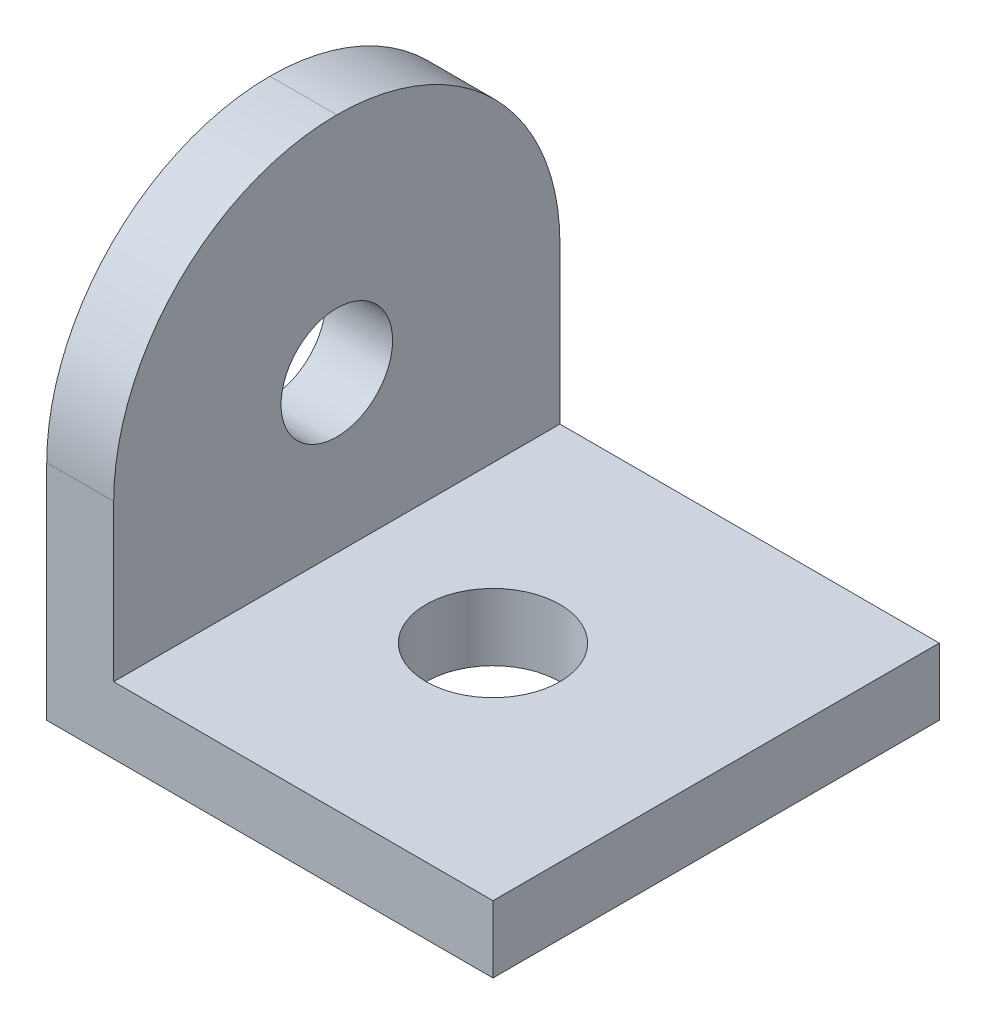
ISO-10303-21;
HEADER;
FILE_DESCRIPTION(('STEP AP214'),'2;1');
FILE_NAME('part.step','',(''),(''),'','','');
FILE_SCHEMA(('AUTOMOTIVE_DESIGN { 1 0 10303 214 1 1 1 1 }'));
ENDSEC;
DATA;
#1=APPLICATION_CONTEXT('core data for automotive mechanical design processes');
#2=APPLICATION_PROTOCOL_DEFINITION('international standard','automotive_design',2000,#1);
#3=PRODUCT_CONTEXT('',#1,'mechanical');
#4=PRODUCT('Part','Part','',(#3));
#5=PRODUCT_RELATED_PRODUCT_CATEGORY('part','',(#4));
#6=PRODUCT_DEFINITION_FORMATION('','',#4);
#7=PRODUCT_DEFINITION_CONTEXT('part definition',#1,'design');
#8=PRODUCT_DEFINITION('design','',#6,#7);
#9=PRODUCT_DEFINITION_SHAPE('','',#8);
#10=(LENGTH_UNIT() NAMED_UNIT(*) SI_UNIT(.MILLI.,.METRE.));
#11=(NAMED_UNIT(*) PLANE_ANGLE_UNIT() SI_UNIT($,.RADIAN.));
#12=(NAMED_UNIT(*) SI_UNIT($,.STERADIAN.) SOLID_ANGLE_UNIT());
#13=UNCERTAINTY_MEASURE_WITH_UNIT(LENGTH_MEASURE(1.E-05),#10,'distance_accuracy_value','');
#14=(GEOMETRIC_REPRESENTATION_CONTEXT(3) GLOBAL_UNCERTAINTY_ASSIGNED_CONTEXT((#13)) GLOBAL_UNIT_ASSIGNED_CONTEXT((#10,
#11,#12)) REPRESENTATION_CONTEXT('',''));
#15=CARTESIAN_POINT('',(0.,0.,0.));
#16=DIRECTION('',(0.,0.,1.));
#17=DIRECTION('',(1.,0.,0.));
#18=AXIS2_PLACEMENT_3D('',#15,#16,#17);
#19=CARTESIAN_POINT('',(10.,20.,-10.));
#20=DIRECTION('',(-1.,0.,0.));
#21=DIRECTION('',(0.,0.,1.));
#22=AXIS2_PLACEMENT_3D('',#19,#20,#21);
#23=PLANE('',#22);
#24=DIRECTION('',(0.,-1.,0.));
#25=VECTOR('',#24,1.);
#26=CARTESIAN_POINT('',(10.,20.,-10.));
#27=LINE('',#26,#25);
#28=CARTESIAN_POINT('',(10.,3.,-10.));
#29=VERTEX_POINT('',#28);
#30=CARTESIAN_POINT('',(10.,0.,-10.));
#31=VERTEX_POINT('',#30);
#32=EDGE_CURVE('E141',#29,#31,#27,.T.);
#33=ORIENTED_EDGE('',*,*,#32,.F.);
#34=DIRECTION('',(0.,0.,1.));
#35=VECTOR('',#34,1.);
#36=CARTESIAN_POINT('',(10.,3.,-10.));
#37=LINE('',#36,#35);
#38=CARTESIAN_POINT('',(10.,3.,10.));
#39=VERTEX_POINT('',#38);
#40=EDGE_CURVE('E113',#29,#39,#37,.T.);
#41=ORIENTED_EDGE('',*,*,#40,.T.);
#42=DIRECTION('',(0.,-1.,0.));
#43=VECTOR('',#42,1.);
#44=CARTESIAN_POINT('',(10.,20.,10.));
#45=LINE('',#44,#43);
#46=CARTESIAN_POINT('',(10.,0.,10.));
#47=VERTEX_POINT('',#46);
#48=EDGE_CURVE('E135',#39,#47,#45,.T.);
#49=ORIENTED_EDGE('',*,*,#48,.T.);
#50=DIRECTION('',(0.,0.,-1.));
#51=VECTOR('',#50,1.);
#52=CARTESIAN_POINT('',(10.,0.,-10.));
#53=LINE('',#52,#51);
#54=EDGE_CURVE('E122',#47,#31,#53,.T.);
#55=ORIENTED_EDGE('',*,*,#54,.T.);
#56=EDGE_LOOP('',(#33,#41,#49,#55));
#57=FACE_BOUND('',#56,.T.);
#58=ADVANCED_FACE('F40',(#57),#23,.F.);
#59=CARTESIAN_POINT('',(-10.,20.,-10.));
#60=DIRECTION('',(0.,0.,1.));
#61=DIRECTION('',(1.,0.,0.));
#62=AXIS2_PLACEMENT_3D('',#59,#60,#61);
#63=PLANE('',#62);
#64=DIRECTION('',(0.,-1.,0.));
#65=VECTOR('',#64,1.);
#66=CARTESIAN_POINT('',(-10.,20.,-10.));
#67=LINE('',#66,#65);
#68=CARTESIAN_POINT('',(-10.,10.,-10.));
#69=VERTEX_POINT('',#68);
#70=CARTESIAN_POINT('',(-10.,0.,-10.));
#71=VERTEX_POINT('',#70);
#72=EDGE_CURVE('E139',#69,#71,#67,.T.);
#73=ORIENTED_EDGE('',*,*,#72,.F.);
#74=DIRECTION('',(-1.,0.,0.));
#75=VECTOR('',#74,1.);
#76=CARTESIAN_POINT('',(-7.,10.,-10.));
#77=LINE('',#76,#75);
#78=CARTESIAN_POINT('',(-7.,10.,-10.));
#79=VERTEX_POINT('',#78);
#80=EDGE_CURVE('E104',#69,#79,#77,.F.);
#81=ORIENTED_EDGE('',*,*,#80,.T.);
#82=DIRECTION('',(0.,-1.,0.));
#83=VECTOR('',#82,1.);
#84=CARTESIAN_POINT('',(-7.,20.,-10.));
#85=LINE('',#84,#83);
#86=CARTESIAN_POINT('',(-7.,3.,-10.));
#87=VERTEX_POINT('',#86);
#88=EDGE_CURVE('E96',#79,#87,#85,.T.);
#89=ORIENTED_EDGE('',*,*,#88,.T.);
#90=DIRECTION('',(1.,0.,0.));
#91=VECTOR('',#90,1.);
#92=CARTESIAN_POINT('',(-7.,3.,-10.));
#93=LINE('',#92,#91);
#94=EDGE_CURVE('E101',#87,#29,#93,.T.);
#95=ORIENTED_EDGE('',*,*,#94,.T.);
#96=ORIENTED_EDGE('',*,*,#32,.T.);
#97=DIRECTION('',(-1.,0.,0.));
#98=VECTOR('',#97,1.);
#99=CARTESIAN_POINT('',(-10.,0.,-10.));
#100=LINE('',#99,#98);
#101=EDGE_CURVE('E126',#31,#71,#100,.T.);
#102=ORIENTED_EDGE('',*,*,#101,.T.);
#103=EDGE_LOOP('',(#73,#81,#89,#95,#96,#102));
#104=FACE_BOUND('',#103,.T.);
#105=ADVANCED_FACE('F99',(#104),#63,.F.);
#106=CARTESIAN_POINT('',(-10.,20.,-10.));
#107=DIRECTION('',(1.,0.,0.));
#108=DIRECTION('',(0.,0.,-1.));
#109=AXIS2_PLACEMENT_3D('',#106,#107,#108);
#110=PLANE('',#109);
#111=CARTESIAN_POINT('',(-10.,10.,0.));
#112=DIRECTION('',(1.,0.,0.));
#113=DIRECTION('',(0.,0.,-1.));
#114=AXIS2_PLACEMENT_3D('',#111,#112,#113);
#115=CIRCLE('',#114,2.5);
#116=CARTESIAN_POINT('',(-10.,10.,-2.5));
#117=VERTEX_POINT('',#116);
#118=EDGE_CURVE('E161',#117,#117,#115,.T.);
#119=ORIENTED_EDGE('',*,*,#118,.T.);
#120=EDGE_LOOP('',(#119));
#121=FACE_BOUND('',#120,.T.);
#122=CARTESIAN_POINT('',(-10.,10.,0.));
#123=DIRECTION('',(1.,0.,0.));
#124=DIRECTION('',(0.,0.,-1.));
#125=AXIS2_PLACEMENT_3D('',#122,#123,#124);
#126=CIRCLE('',#125,10.);
#127=CARTESIAN_POINT('',(-10.,10.,10.));
#128=VERTEX_POINT('',#127);
#129=CARTESIAN_POINT('',(-10.,20.,0.));
#130=VERTEX_POINT('',#129);
#131=EDGE_CURVE('E143',#128,#130,#126,.F.);
#132=ORIENTED_EDGE('',*,*,#131,.T.);
#133=CARTESIAN_POINT('',(-10.,10.,0.));
#134=DIRECTION('',(1.,0.,0.));
#135=DIRECTION('',(0.,0.,-1.));
#136=AXIS2_PLACEMENT_3D('',#133,#134,#135);
#137=CIRCLE('',#136,10.);
#138=EDGE_CURVE('E145',#130,#69,#137,.F.);
#139=ORIENTED_EDGE('',*,*,#138,.T.);
#140=ORIENTED_EDGE('',*,*,#72,.T.);
#141=DIRECTION('',(0.,0.,1.));
#142=VECTOR('',#141,1.);
#143=CARTESIAN_POINT('',(-10.,0.,-10.));
#144=LINE('',#143,#142);
#145=CARTESIAN_POINT('',(-10.,0.,10.));
#146=VERTEX_POINT('',#145);
#147=EDGE_CURVE('E129',#71,#146,#144,.T.);
#148=ORIENTED_EDGE('',*,*,#147,.T.);
#149=DIRECTION('',(0.,-1.,0.));
#150=VECTOR('',#149,1.);
#151=CARTESIAN_POINT('',(-10.,20.,10.));
#152=LINE('',#151,#150);
#153=EDGE_CURVE('E137',#128,#146,#152,.T.);
#154=ORIENTED_EDGE('',*,*,#153,.F.);
#155=EDGE_LOOP('',(#132,#139,#140,#148,#154));
#156=FACE_BOUND('',#155,.T.);
#157=ADVANCED_FACE('F151',(#121,#156),#110,.F.);
#158=CARTESIAN_POINT('',(-10.,20.,10.));
#159=DIRECTION('',(0.,0.,-1.));
#160=DIRECTION('',(-1.,0.,0.));
#161=AXIS2_PLACEMENT_3D('',#158,#159,#160);
#162=PLANE('',#161);
#163=DIRECTION('',(0.,-1.,0.));
#164=VECTOR('',#163,1.);
#165=CARTESIAN_POINT('',(-7.,20.,10.));
#166=LINE('',#165,#164);
#167=CARTESIAN_POINT('',(-7.,10.,10.));
#168=VERTEX_POINT('',#167);
#169=CARTESIAN_POINT('',(-7.,3.,10.));
#170=VERTEX_POINT('',#169);
#171=EDGE_CURVE('E110',#168,#170,#166,.T.);
#172=ORIENTED_EDGE('',*,*,#171,.F.);
#173=DIRECTION('',(1.,0.,0.));
#174=VECTOR('',#173,1.);
#175=CARTESIAN_POINT('',(-10.,10.,10.));
#176=LINE('',#175,#174);
#177=EDGE_CURVE('E11',#168,#128,#176,.F.);
#178=ORIENTED_EDGE('',*,*,#177,.T.);
#179=ORIENTED_EDGE('',*,*,#153,.T.);
#180=DIRECTION('',(1.,0.,0.));
#181=VECTOR('',#180,1.);
#182=CARTESIAN_POINT('',(-10.,0.,10.));
#183=LINE('',#182,#181);
#184=EDGE_CURVE('E132',#146,#47,#183,.T.);
#185=ORIENTED_EDGE('',*,*,#184,.T.);
#186=ORIENTED_EDGE('',*,*,#48,.F.);
#187=DIRECTION('',(1.,0.,0.));
#188=VECTOR('',#187,1.);
#189=CARTESIAN_POINT('',(-7.,3.,10.));
#190=LINE('',#189,#188);
#191=EDGE_CURVE('E105',#170,#39,#190,.T.);
#192=ORIENTED_EDGE('',*,*,#191,.F.);
#193=EDGE_LOOP('',(#172,#178,#179,#185,#186,#192));
#194=FACE_BOUND('',#193,.T.);
#195=ADVANCED_FACE('F188',(#194),#162,.F.);
#196=CARTESIAN_POINT('',(0.,0.,0.));
#197=DIRECTION('',(0.,1.,0.));
#198=DIRECTION('',(0.,0.,1.));
#199=AXIS2_PLACEMENT_3D('',#196,#197,#198);
#200=PLANE('',#199);
#201=CARTESIAN_POINT('',(0.,0.,0.));
#202=DIRECTION('',(0.,1.,0.));
#203=DIRECTION('',(0.,0.,1.));
#204=AXIS2_PLACEMENT_3D('',#201,#202,#203);
#205=CIRCLE('',#204,3.);
#206=CARTESIAN_POINT('',(0.,0.,3.));
#207=VERTEX_POINT('',#206);
#208=EDGE_CURVE('E167',#207,#207,#205,.T.);
#209=ORIENTED_EDGE('',*,*,#208,.T.);
#210=EDGE_LOOP('',(#209));
#211=FACE_BOUND('',#210,.T.);
#212=ORIENTED_EDGE('',*,*,#54,.F.);
#213=ORIENTED_EDGE('',*,*,#184,.F.);
#214=ORIENTED_EDGE('',*,*,#147,.F.);
#215=ORIENTED_EDGE('',*,*,#101,.F.);
#216=EDGE_LOOP('',(#212,#213,#214,#215));
#217=FACE_BOUND('',#216,.T.);
#218=ADVANCED_FACE('F180',(#211,#217),#200,.F.);
#219=CARTESIAN_POINT('',(-7.,3.,-10.));
#220=DIRECTION('',(0.,-1.,0.));
#221=DIRECTION('',(0.,0.,-1.));
#222=AXIS2_PLACEMENT_3D('',#219,#220,#221);
#223=PLANE('',#222);
#224=CARTESIAN_POINT('',(0.,3.,0.));
#225=DIRECTION('',(0.,1.,0.));
#226=DIRECTION('',(0.,0.,1.));
#227=AXIS2_PLACEMENT_3D('',#224,#225,#226);
#228=CIRCLE('',#227,3.);
#229=CARTESIAN_POINT('',(0.,3.,3.));
#230=VERTEX_POINT('',#229);
#231=EDGE_CURVE('E172',#230,#230,#228,.T.);
#232=ORIENTED_EDGE('',*,*,#231,.F.);
#233=EDGE_LOOP('',(#232));
#234=FACE_BOUND('',#233,.T.);
#235=ORIENTED_EDGE('',*,*,#191,.T.);
#236=ORIENTED_EDGE('',*,*,#40,.F.);
#237=ORIENTED_EDGE('',*,*,#94,.F.);
#238=DIRECTION('',(0.,0.,1.));
#239=VECTOR('',#238,1.);
#240=CARTESIAN_POINT('',(-7.,3.,-10.));
#241=LINE('',#240,#239);
#242=EDGE_CURVE('E108',#87,#170,#241,.T.);
#243=ORIENTED_EDGE('',*,*,#242,.T.);
#244=EDGE_LOOP('',(#235,#236,#237,#243));
#245=FACE_BOUND('',#244,.T.);
#246=ADVANCED_FACE('F115',(#234,#245),#223,.F.);
#247=CARTESIAN_POINT('',(-7.,20.,-10.));
#248=DIRECTION('',(-1.,0.,0.));
#249=DIRECTION('',(0.,0.,1.));
#250=AXIS2_PLACEMENT_3D('',#247,#248,#249);
#251=PLANE('',#250);
#252=CARTESIAN_POINT('',(-7.,10.,0.));
#253=DIRECTION('',(1.,0.,0.));
#254=DIRECTION('',(0.,0.,-1.));
#255=AXIS2_PLACEMENT_3D('',#252,#253,#254);
#256=CIRCLE('',#255,2.5);
#257=CARTESIAN_POINT('',(-7.,10.,-2.5));
#258=VERTEX_POINT('',#257);
#259=EDGE_CURVE('E163',#258,#258,#256,.T.);
#260=ORIENTED_EDGE('',*,*,#259,.F.);
#261=EDGE_LOOP('',(#260));
#262=FACE_BOUND('',#261,.T.);
#263=ORIENTED_EDGE('',*,*,#88,.F.);
#264=CARTESIAN_POINT('',(-7.,10.,0.));
#265=DIRECTION('',(-1.,0.,0.));
#266=DIRECTION('',(0.,0.,1.));
#267=AXIS2_PLACEMENT_3D('',#264,#265,#266);
#268=CIRCLE('',#267,10.);
#269=CARTESIAN_POINT('',(-7.,20.,0.));
#270=VERTEX_POINT('',#269);
#271=EDGE_CURVE('E49',#79,#270,#268,.F.);
#272=ORIENTED_EDGE('',*,*,#271,.T.);
#273=CARTESIAN_POINT('',(-7.,10.,0.));
#274=DIRECTION('',(-1.,0.,0.));
#275=DIRECTION('',(0.,0.,1.));
#276=AXIS2_PLACEMENT_3D('',#273,#274,#275);
#277=CIRCLE('',#276,10.);
#278=EDGE_CURVE('E59',#270,#168,#277,.F.);
#279=ORIENTED_EDGE('',*,*,#278,.T.);
#280=ORIENTED_EDGE('',*,*,#171,.T.);
#281=ORIENTED_EDGE('',*,*,#242,.F.);
#282=EDGE_LOOP('',(#263,#272,#279,#280,#281));
#283=FACE_BOUND('',#282,.T.);
#284=ADVANCED_FACE('F109',(#262,#283),#251,.F.);
#285=CARTESIAN_POINT('',(0.,10.,0.));
#286=DIRECTION('',(-1.,0.,0.));
#287=DIRECTION('',(0.,0.,1.));
#288=AXIS2_PLACEMENT_3D('',#285,#286,#287);
#289=CYLINDRICAL_SURFACE('',#288,10.);
#290=ORIENTED_EDGE('',*,*,#177,.F.);
#291=ORIENTED_EDGE('',*,*,#278,.F.);
#292=DIRECTION('',(1.,0.,0.));
#293=VECTOR('',#292,1.);
#294=CARTESIAN_POINT('',(-7.,20.,0.));
#295=LINE('',#294,#293);
#296=EDGE_CURVE('E44',#130,#270,#295,.T.);
#297=ORIENTED_EDGE('',*,*,#296,.F.);
#298=ORIENTED_EDGE('',*,*,#131,.F.);
#299=EDGE_LOOP('',(#290,#291,#297,#298));
#300=FACE_BOUND('',#299,.T.);
#301=ADVANCED_FACE('F42',(#300),#289,.T.);
#302=CARTESIAN_POINT('',(0.,10.,0.));
#303=DIRECTION('',(1.,0.,0.));
#304=DIRECTION('',(0.,0.,-1.));
#305=AXIS2_PLACEMENT_3D('',#302,#303,#304);
#306=CYLINDRICAL_SURFACE('',#305,10.);
#307=ORIENTED_EDGE('',*,*,#271,.F.);
#308=ORIENTED_EDGE('',*,*,#80,.F.);
#309=ORIENTED_EDGE('',*,*,#138,.F.);
#310=ORIENTED_EDGE('',*,*,#296,.T.);
#311=EDGE_LOOP('',(#307,#308,#309,#310));
#312=FACE_BOUND('',#311,.T.);
#313=ADVANCED_FACE('F159',(#312),#306,.T.);
#314=CARTESIAN_POINT('',(-27.,10.,0.));
#315=DIRECTION('',(1.,0.,0.));
#316=DIRECTION('',(0.,0.,-1.));
#317=AXIS2_PLACEMENT_3D('',#314,#315,#316);
#318=CYLINDRICAL_SURFACE('',#317,2.5);
#319=ORIENTED_EDGE('',*,*,#259,.T.);
#320=EDGE_LOOP('',(#319));
#321=FACE_BOUND('',#320,.T.);
#322=ORIENTED_EDGE('',*,*,#118,.F.);
#323=EDGE_LOOP('',(#322));
#324=FACE_BOUND('',#323,.T.);
#325=ADVANCED_FACE('F201',(#321,#324),#318,.F.);
#326=CARTESIAN_POINT('',(0.,-17.,0.));
#327=DIRECTION('',(0.,1.,0.));
#328=DIRECTION('',(0.,0.,1.));
#329=AXIS2_PLACEMENT_3D('',#326,#327,#328);
#330=CYLINDRICAL_SURFACE('',#329,3.);
#331=ORIENTED_EDGE('',*,*,#231,.T.);
#332=EDGE_LOOP('',(#331));
#333=FACE_BOUND('',#332,.T.);
#334=ORIENTED_EDGE('',*,*,#208,.F.);
#335=EDGE_LOOP('',(#334));
#336=FACE_BOUND('',#335,.T.);
#337=ADVANCED_FACE('F176',(#333,#336),#330,.F.);
#338=CLOSED_SHELL('',(#58,#105,#157,#195,#218,#246,#284,#301,#313,#325,#337));
#339=MANIFOLD_SOLID_BREP('B2',#338);
#340=ADVANCED_BREP_SHAPE_REPRESENTATION('',(#18,#339),#14);
#341=SHAPE_DEFINITION_REPRESENTATION(#9,#340);
ENDSEC;
END-ISO-10303-21;
